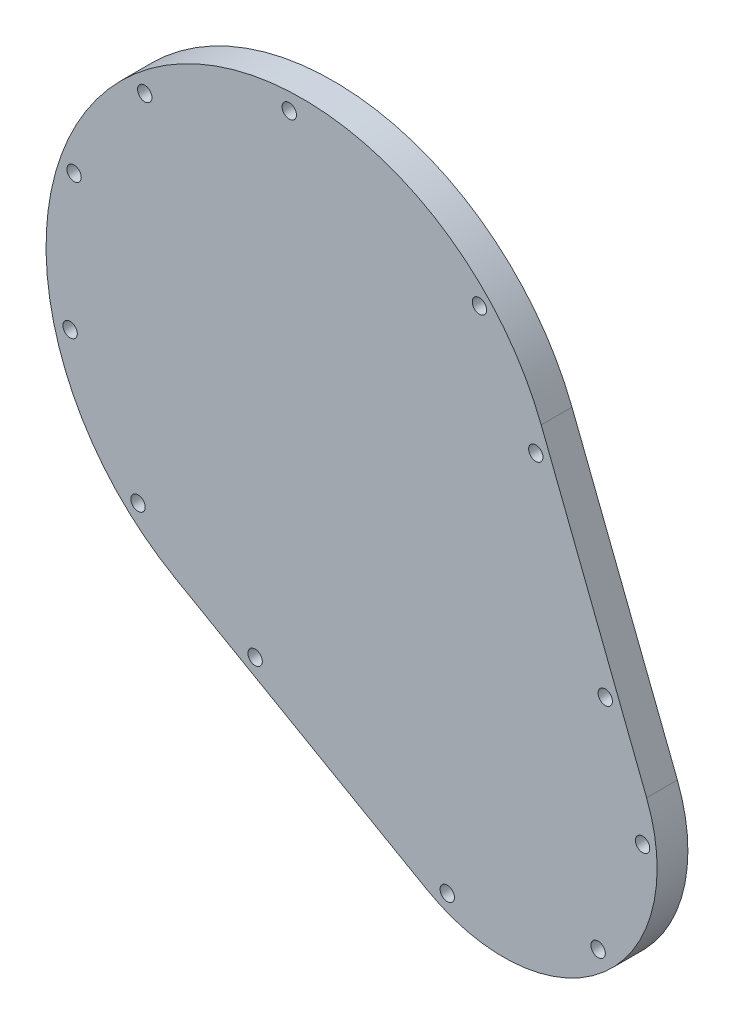
ISO-10303-21;
HEADER;
FILE_DESCRIPTION(('STEP AP214'),'2;1');
FILE_NAME('part.step','',(''),(''),'','','');
FILE_SCHEMA(('AUTOMOTIVE_DESIGN { 1 0 10303 214 1 1 1 1 }'));
ENDSEC;
DATA;
#1=APPLICATION_CONTEXT('core data for automotive mechanical design processes');
#2=APPLICATION_PROTOCOL_DEFINITION('international standard','automotive_design',2000,#1);
#3=PRODUCT_CONTEXT('',#1,'mechanical');
#4=PRODUCT('Part','Part','',(#3));
#5=PRODUCT_RELATED_PRODUCT_CATEGORY('part','',(#4));
#6=PRODUCT_DEFINITION_FORMATION('','',#4);
#7=PRODUCT_DEFINITION_CONTEXT('part definition',#1,'design');
#8=PRODUCT_DEFINITION('design','',#6,#7);
#9=PRODUCT_DEFINITION_SHAPE('','',#8);
#10=(LENGTH_UNIT() NAMED_UNIT(*) SI_UNIT(.MILLI.,.METRE.));
#11=(NAMED_UNIT(*) PLANE_ANGLE_UNIT() SI_UNIT($,.RADIAN.));
#12=(NAMED_UNIT(*) SI_UNIT($,.STERADIAN.) SOLID_ANGLE_UNIT());
#13=UNCERTAINTY_MEASURE_WITH_UNIT(LENGTH_MEASURE(1.E-05),#10,'distance_accuracy_value','');
#14=(GEOMETRIC_REPRESENTATION_CONTEXT(3) GLOBAL_UNCERTAINTY_ASSIGNED_CONTEXT((#13)) GLOBAL_UNIT_ASSIGNED_CONTEXT((#10,
#11,#12)) REPRESENTATION_CONTEXT('',''));
#15=CARTESIAN_POINT('',(0.,0.,0.));
#16=DIRECTION('',(0.,0.,1.));
#17=DIRECTION('',(1.,0.,0.));
#18=AXIS2_PLACEMENT_3D('',#15,#16,#17);
#19=CARTESIAN_POINT('',(15.7540834815016,27.5657641587872,3.81));
#20=DIRECTION('',(0.,0.,-1.));
#21=DIRECTION('',(-1.,0.,0.));
#22=AXIS2_PLACEMENT_3D('',#19,#20,#21);
#23=CYLINDRICAL_SURFACE('',#22,31.75);
#24=CARTESIAN_POINT('',(15.7540834815016,27.5657641587872,0.));
#25=DIRECTION('',(0.,0.,1.));
#26=DIRECTION('',(1.,0.,0.));
#27=AXIS2_PLACEMENT_3D('',#24,#25,#26);
#28=CIRCLE('',#27,31.75);
#29=CARTESIAN_POINT('',(45.3334273140184,39.1037413834896,0.));
#30=VERTEX_POINT('',#29);
#31=CARTESIAN_POINT('',(0.,0.,0.));
#32=VERTEX_POINT('',#31);
#33=EDGE_CURVE('E113',#30,#32,#28,.T.);
#34=ORIENTED_EDGE('',*,*,#33,.T.);
#35=DIRECTION('',(0.,0.,-1.));
#36=VECTOR('',#35,1.);
#37=CARTESIAN_POINT('',(0.,0.,3.81));
#38=LINE('',#37,#36);
#39=CARTESIAN_POINT('',(0.,0.,3.81));
#40=VERTEX_POINT('',#39);
#41=EDGE_CURVE('E11',#40,#32,#38,.T.);
#42=ORIENTED_EDGE('',*,*,#41,.F.);
#43=CARTESIAN_POINT('',(15.7540834815016,27.5657641587872,3.81));
#44=DIRECTION('',(0.,0.,1.));
#45=DIRECTION('',(1.,0.,0.));
#46=AXIS2_PLACEMENT_3D('',#43,#44,#45);
#47=CIRCLE('',#46,31.75);
#48=CARTESIAN_POINT('',(45.3334273140184,39.1037413834896,3.81));
#49=VERTEX_POINT('',#48);
#50=EDGE_CURVE('E97',#49,#40,#47,.T.);
#51=ORIENTED_EDGE('',*,*,#50,.F.);
#52=DIRECTION('',(0.,0.,-1.));
#53=VECTOR('',#52,1.);
#54=CARTESIAN_POINT('',(45.3334273140184,39.1037413834896,3.81));
#55=LINE('',#54,#53);
#56=EDGE_CURVE('E109',#49,#30,#55,.T.);
#57=ORIENTED_EDGE('',*,*,#56,.T.);
#58=EDGE_LOOP('',(#34,#42,#51,#57));
#59=FACE_BOUND('',#58,.T.);
#60=ADVANCED_FACE('F45',(#59),#23,.T.);
#61=CARTESIAN_POINT('',(0.,0.,3.81));
#62=DIRECTION('',(0.496191605716585,0.868213044371252,0.));
#63=DIRECTION('',(-0.868213044371252,0.496191605716585,0.));
#64=AXIS2_PLACEMENT_3D('',#61,#62,#63);
#65=PLANE('',#64);
#66=DIRECTION('',(0.868213044371252,-0.496191605716584,0.));
#67=VECTOR('',#66,1.);
#68=CARTESIAN_POINT('',(0.,0.,0.));
#69=LINE('',#68,#67);
#70=CARTESIAN_POINT('',(31.1871020244281,-17.823710817838,0.));
#71=VERTEX_POINT('',#70);
#72=EDGE_CURVE('E102',#32,#71,#69,.T.);
#73=ORIENTED_EDGE('',*,*,#72,.T.);
#74=DIRECTION('',(0.,0.,-1.));
#75=VECTOR('',#74,1.);
#76=CARTESIAN_POINT('',(31.1871020244281,-17.823710817838,3.81));
#77=LINE('',#76,#75);
#78=CARTESIAN_POINT('',(31.1871020244281,-17.823710817838,3.81));
#79=VERTEX_POINT('',#78);
#80=EDGE_CURVE('E54',#79,#71,#77,.T.);
#81=ORIENTED_EDGE('',*,*,#80,.F.);
#82=DIRECTION('',(0.868213044371252,-0.496191605716584,0.));
#83=VECTOR('',#82,1.);
#84=CARTESIAN_POINT('',(0.,0.,3.81));
#85=LINE('',#84,#83);
#86=EDGE_CURVE('E92',#40,#79,#85,.T.);
#87=ORIENTED_EDGE('',*,*,#86,.F.);
#88=ORIENTED_EDGE('',*,*,#41,.T.);
#89=EDGE_LOOP('',(#73,#81,#87,#88));
#90=FACE_BOUND('',#89,.T.);
#91=ADVANCED_FACE('F101',(#90),#65,.F.);
#92=CARTESIAN_POINT('',(40.639552113329,-1.28425232256561,3.81));
#93=DIRECTION('',(0.,0.,-1.));
#94=DIRECTION('',(-1.,0.,0.));
#95=AXIS2_PLACEMENT_3D('',#92,#93,#94);
#96=CYLINDRICAL_SURFACE('',#95,19.05);
#97=CARTESIAN_POINT('',(40.639552113329,-1.28425232256561,0.));
#98=DIRECTION('',(0.,0.,1.));
#99=DIRECTION('',(1.,0.,0.));
#100=AXIS2_PLACEMENT_3D('',#97,#98,#99);
#101=CIRCLE('',#100,19.05);
#102=CARTESIAN_POINT('',(58.3871584128391,5.63853401225579,0.));
#103=VERTEX_POINT('',#102);
#104=EDGE_CURVE('E79',#71,#103,#101,.T.);
#105=ORIENTED_EDGE('',*,*,#104,.T.);
#106=DIRECTION('',(0.,0.,-1.));
#107=VECTOR('',#106,1.);
#108=CARTESIAN_POINT('',(58.3871584128391,5.63853401225579,3.81));
#109=LINE('',#108,#107);
#110=CARTESIAN_POINT('',(58.3871584128391,5.63853401225579,3.81));
#111=VERTEX_POINT('',#110);
#112=EDGE_CURVE('E104',#111,#103,#109,.T.);
#113=ORIENTED_EDGE('',*,*,#112,.F.);
#114=CARTESIAN_POINT('',(40.639552113329,-1.28425232256561,3.81));
#115=DIRECTION('',(0.,0.,1.));
#116=DIRECTION('',(1.,0.,0.));
#117=AXIS2_PLACEMENT_3D('',#114,#115,#116);
#118=CIRCLE('',#117,19.05);
#119=EDGE_CURVE('E95',#79,#111,#118,.T.);
#120=ORIENTED_EDGE('',*,*,#119,.F.);
#121=ORIENTED_EDGE('',*,*,#80,.T.);
#122=EDGE_LOOP('',(#105,#113,#120,#121));
#123=FACE_BOUND('',#122,.T.);
#124=ADVANCED_FACE('F105',(#123),#96,.T.);
#125=CARTESIAN_POINT('',(58.3871584128391,5.63853401225578,3.81));
#126=DIRECTION('',(-0.931632876614703,-0.363400857470939,0.));
#127=DIRECTION('',(0.363400857470939,-0.931632876614703,0.));
#128=AXIS2_PLACEMENT_3D('',#125,#126,#127);
#129=PLANE('',#128);
#130=DIRECTION('',(-0.363400857470939,0.931632876614703,0.));
#131=VECTOR('',#130,1.);
#132=CARTESIAN_POINT('',(58.3871584128391,5.63853401225578,0.));
#133=LINE('',#132,#131);
#134=EDGE_CURVE('E85',#103,#30,#133,.T.);
#135=ORIENTED_EDGE('',*,*,#134,.T.);
#136=ORIENTED_EDGE('',*,*,#56,.F.);
#137=DIRECTION('',(-0.363400857470939,0.931632876614703,0.));
#138=VECTOR('',#137,1.);
#139=CARTESIAN_POINT('',(58.3871584128391,5.63853401225578,3.81));
#140=LINE('',#139,#138);
#141=EDGE_CURVE('E62',#111,#49,#140,.T.);
#142=ORIENTED_EDGE('',*,*,#141,.F.);
#143=ORIENTED_EDGE('',*,*,#112,.T.);
#144=EDGE_LOOP('',(#135,#136,#142,#143));
#145=FACE_BOUND('',#144,.T.);
#146=ADVANCED_FACE('F127',(#145),#129,.F.);
#147=CARTESIAN_POINT('',(15.7540834815016,27.5657641587872,3.81));
#148=DIRECTION('',(0.,0.,1.));
#149=DIRECTION('',(1.,0.,0.));
#150=AXIS2_PLACEMENT_3D('',#147,#148,#149);
#151=PLANE('',#150);
#152=CARTESIAN_POINT('',(-3.77016974643415,50.098384989217,3.81));
#153=DIRECTION('',(0.,0.,1.));
#154=DIRECTION('',(1.,0.,0.));
#155=AXIS2_PLACEMENT_3D('',#152,#153,#154);
#156=CIRCLE('',#155,0.888999999999987);
#157=CARTESIAN_POINT('',(-2.88116974643417,50.098384989217,3.81));
#158=VERTEX_POINT('',#157);
#159=EDGE_CURVE('E225',#158,#158,#156,.T.);
#160=ORIENTED_EDGE('',*,*,#159,.F.);
#161=EDGE_LOOP('',(#160));
#162=FACE_BOUND('',#161,.T.);
#163=CARTESIAN_POINT('',(14.1273033168311,57.178704003256,3.81));
#164=DIRECTION('',(0.,0.,1.));
#165=DIRECTION('',(1.,0.,0.));
#166=AXIS2_PLACEMENT_3D('',#163,#164,#165);
#167=CIRCLE('',#166,0.888999999999987);
#168=CARTESIAN_POINT('',(15.0163033168311,57.178704003256,3.81));
#169=VERTEX_POINT('',#168);
#170=EDGE_CURVE('E217',#169,#169,#167,.T.);
#171=ORIENTED_EDGE('',*,*,#170,.F.);
#172=EDGE_LOOP('',(#171));
#173=FACE_BOUND('',#172,.T.);
#174=CARTESIAN_POINT('',(37.6791978149192,48.0332919434556,3.81));
#175=DIRECTION('',(0.,0.,1.));
#176=DIRECTION('',(1.,0.,0.));
#177=AXIS2_PLACEMENT_3D('',#174,#175,#176);
#178=CIRCLE('',#177,0.888999999999987);
#179=CARTESIAN_POINT('',(38.5681978149191,48.0332919434556,3.81));
#180=VERTEX_POINT('',#179);
#181=EDGE_CURVE('E209',#180,#180,#178,.T.);
#182=ORIENTED_EDGE('',*,*,#181,.F.);
#183=EDGE_LOOP('',(#182));
#184=FACE_BOUND('',#183,.T.);
#185=CARTESIAN_POINT('',(57.8876083341555,0.388645244818161,3.81));
#186=DIRECTION('',(0.,0.,1.));
#187=DIRECTION('',(1.,0.,0.));
#188=AXIS2_PLACEMENT_3D('',#185,#186,#187);
#189=CIRCLE('',#188,0.888999999999987);
#190=CARTESIAN_POINT('',(58.7766083341554,0.388645244818161,3.81));
#191=VERTEX_POINT('',#190);
#192=EDGE_CURVE('E201',#191,#191,#189,.T.);
#193=ORIENTED_EDGE('',*,*,#192,.F.);
#194=EDGE_LOOP('',(#193));
#195=FACE_BOUND('',#194,.T.);
#196=CARTESIAN_POINT('',(52.3806935454585,-13.624486137134,3.81));
#197=DIRECTION('',(0.,0.,1.));
#198=DIRECTION('',(1.,0.,0.));
#199=AXIS2_PLACEMENT_3D('',#196,#197,#198);
#200=CIRCLE('',#199,0.888999999999987);
#201=CARTESIAN_POINT('',(53.2696935454585,-13.624486137134,3.81));
#202=VERTEX_POINT('',#201);
#203=EDGE_CURVE('E193',#202,#202,#200,.T.);
#204=ORIENTED_EDGE('',*,*,#203,.F.);
#205=EDGE_LOOP('',(#204));
#206=FACE_BOUND('',#205,.T.);
#207=CARTESIAN_POINT('',(33.6965183695222,-16.9679701159858,3.81));
#208=DIRECTION('',(0.,0.,1.));
#209=DIRECTION('',(1.,0.,0.));
#210=AXIS2_PLACEMENT_3D('',#207,#208,#209);
#211=CIRCLE('',#210,0.888999999999987);
#212=CARTESIAN_POINT('',(34.5855183695222,-16.9679701159858,3.81));
#213=VERTEX_POINT('',#212);
#214=EDGE_CURVE('E185',#213,#213,#211,.T.);
#215=ORIENTED_EDGE('',*,*,#214,.F.);
#216=EDGE_LOOP('',(#215));
#217=FACE_BOUND('',#216,.T.);
#218=CARTESIAN_POINT('',(9.89877946122447,-3.54486531853684,3.81));
#219=DIRECTION('',(0.,0.,1.));
#220=DIRECTION('',(1.,0.,0.));
#221=AXIS2_PLACEMENT_3D('',#218,#219,#220);
#222=CIRCLE('',#221,0.888999999999987);
#223=CARTESIAN_POINT('',(10.7877794612245,-3.54486531853684,3.81));
#224=VERTEX_POINT('',#223);
#225=EDGE_CURVE('E177',#224,#224,#222,.T.);
#226=ORIENTED_EDGE('',*,*,#225,.F.);
#227=EDGE_LOOP('',(#226));
#228=FACE_BOUND('',#227,.T.);
#229=CARTESIAN_POINT('',(-4.60604074114709,5.74805338738934,3.81));
#230=DIRECTION('',(0.,0.,1.));
#231=DIRECTION('',(1.,0.,0.));
#232=AXIS2_PLACEMENT_3D('',#229,#230,#231);
#233=CIRCLE('',#232,0.888999999999987);
#234=CARTESIAN_POINT('',(-3.71704074114711,5.74805338738934,3.81));
#235=VERTEX_POINT('',#234);
#236=EDGE_CURVE('E169',#235,#235,#233,.T.);
#237=ORIENTED_EDGE('',*,*,#236,.F.);
#238=EDGE_LOOP('',(#237));
#239=FACE_BOUND('',#238,.T.);
#240=CARTESIAN_POINT('',(-13.0139195703184,20.154535825677,3.81));
#241=DIRECTION('',(0.,0.,1.));
#242=DIRECTION('',(1.,0.,0.));
#243=AXIS2_PLACEMENT_3D('',#240,#241,#242);
#244=CIRCLE('',#243,0.888999999999987);
#245=CARTESIAN_POINT('',(-12.1249195703184,20.154535825677,3.81));
#246=VERTEX_POINT('',#245);
#247=EDGE_CURVE('E161',#246,#246,#244,.T.);
#248=ORIENTED_EDGE('',*,*,#247,.F.);
#249=EDGE_LOOP('',(#248));
#250=FACE_BOUND('',#249,.T.);
#251=CARTESIAN_POINT('',(-12.522230749899,37.1669690121874,3.81));
#252=DIRECTION('',(0.,0.,1.));
#253=DIRECTION('',(1.,0.,0.));
#254=AXIS2_PLACEMENT_3D('',#251,#252,#253);
#255=CIRCLE('',#254,0.888999999999987);
#256=CARTESIAN_POINT('',(-11.633230749899,37.1669690121874,3.81));
#257=VERTEX_POINT('',#256);
#258=EDGE_CURVE('E153',#257,#257,#255,.T.);
#259=ORIENTED_EDGE('',*,*,#258,.F.);
#260=EDGE_LOOP('',(#259));
#261=FACE_BOUND('',#260,.T.);
#262=CARTESIAN_POINT('',(44.6611790648743,35.7410714329712,3.81));
#263=DIRECTION('',(0.,0.,1.));
#264=DIRECTION('',(1.,0.,0.));
#265=AXIS2_PLACEMENT_3D('',#262,#263,#264);
#266=CIRCLE('',#265,0.888999999999987);
#267=CARTESIAN_POINT('',(45.5501790648743,35.7410714329712,3.81));
#268=VERTEX_POINT('',#267);
#269=EDGE_CURVE('E145',#268,#268,#266,.T.);
#270=ORIENTED_EDGE('',*,*,#269,.F.);
#271=EDGE_LOOP('',(#270));
#272=FACE_BOUND('',#271,.T.);
#273=CARTESIAN_POINT('',(53.2657334222133,13.860918924309,3.81));
#274=DIRECTION('',(0.,0.,1.));
#275=DIRECTION('',(1.,0.,0.));
#276=AXIS2_PLACEMENT_3D('',#273,#274,#275);
#277=CIRCLE('',#276,0.888999999999987);
#278=CARTESIAN_POINT('',(54.1547334222133,13.860918924309,3.81));
#279=VERTEX_POINT('',#278);
#280=EDGE_CURVE('E137',#279,#279,#277,.T.);
#281=ORIENTED_EDGE('',*,*,#280,.F.);
#282=EDGE_LOOP('',(#281));
#283=FACE_BOUND('',#282,.T.);
#284=ORIENTED_EDGE('',*,*,#50,.T.);
#285=ORIENTED_EDGE('',*,*,#86,.T.);
#286=ORIENTED_EDGE('',*,*,#119,.T.);
#287=ORIENTED_EDGE('',*,*,#141,.T.);
#288=EDGE_LOOP('',(#284,#285,#286,#287));
#289=FACE_BOUND('',#288,.T.);
#290=ADVANCED_FACE('F93',(#162,#173,#184,#195,#206,#217,#228,#239,#250,#261,#272,#283,#289),
#151,.T.);
#291=CARTESIAN_POINT('',(15.7540834815016,27.5657641587872,0.));
#292=DIRECTION('',(0.,0.,1.));
#293=DIRECTION('',(1.,0.,0.));
#294=AXIS2_PLACEMENT_3D('',#291,#292,#293);
#295=PLANE('',#294);
#296=CARTESIAN_POINT('',(-3.77016974643415,50.098384989217,0.));
#297=DIRECTION('',(0.,0.,1.));
#298=DIRECTION('',(1.,0.,0.));
#299=AXIS2_PLACEMENT_3D('',#296,#297,#298);
#300=CIRCLE('',#299,0.888999999999998);
#301=CARTESIAN_POINT('',(-2.88116974643416,50.098384989217,0.));
#302=VERTEX_POINT('',#301);
#303=EDGE_CURVE('E221',#302,#302,#300,.T.);
#304=ORIENTED_EDGE('',*,*,#303,.T.);
#305=EDGE_LOOP('',(#304));
#306=FACE_BOUND('',#305,.T.);
#307=CARTESIAN_POINT('',(14.1273033168311,57.178704003256,0.));
#308=DIRECTION('',(0.,0.,1.));
#309=DIRECTION('',(1.,0.,0.));
#310=AXIS2_PLACEMENT_3D('',#307,#308,#309);
#311=CIRCLE('',#310,0.888999999999997);
#312=CARTESIAN_POINT('',(15.0163033168311,57.178704003256,0.));
#313=VERTEX_POINT('',#312);
#314=EDGE_CURVE('E213',#313,#313,#311,.T.);
#315=ORIENTED_EDGE('',*,*,#314,.T.);
#316=EDGE_LOOP('',(#315));
#317=FACE_BOUND('',#316,.T.);
#318=CARTESIAN_POINT('',(37.6791978149192,48.0332919434556,0.));
#319=DIRECTION('',(0.,0.,1.));
#320=DIRECTION('',(1.,0.,0.));
#321=AXIS2_PLACEMENT_3D('',#318,#319,#320);
#322=CIRCLE('',#321,0.889000000000001);
#323=CARTESIAN_POINT('',(38.5681978149192,48.0332919434556,0.));
#324=VERTEX_POINT('',#323);
#325=EDGE_CURVE('E205',#324,#324,#322,.T.);
#326=ORIENTED_EDGE('',*,*,#325,.T.);
#327=EDGE_LOOP('',(#326));
#328=FACE_BOUND('',#327,.T.);
#329=CARTESIAN_POINT('',(57.8876083341555,0.388645244818161,0.));
#330=DIRECTION('',(0.,0.,1.));
#331=DIRECTION('',(1.,0.,0.));
#332=AXIS2_PLACEMENT_3D('',#329,#330,#331);
#333=CIRCLE('',#332,0.889000000000001);
#334=CARTESIAN_POINT('',(58.7766083341555,0.388645244818161,0.));
#335=VERTEX_POINT('',#334);
#336=EDGE_CURVE('E197',#335,#335,#333,.T.);
#337=ORIENTED_EDGE('',*,*,#336,.T.);
#338=EDGE_LOOP('',(#337));
#339=FACE_BOUND('',#338,.T.);
#340=CARTESIAN_POINT('',(52.3806935454585,-13.624486137134,0.));
#341=DIRECTION('',(0.,0.,1.));
#342=DIRECTION('',(1.,0.,0.));
#343=AXIS2_PLACEMENT_3D('',#340,#341,#342);
#344=CIRCLE('',#343,0.889000000000001);
#345=CARTESIAN_POINT('',(53.2696935454585,-13.624486137134,0.));
#346=VERTEX_POINT('',#345);
#347=EDGE_CURVE('E189',#346,#346,#344,.T.);
#348=ORIENTED_EDGE('',*,*,#347,.T.);
#349=EDGE_LOOP('',(#348));
#350=FACE_BOUND('',#349,.T.);
#351=CARTESIAN_POINT('',(33.6965183695222,-16.9679701159858,0.));
#352=DIRECTION('',(0.,0.,1.));
#353=DIRECTION('',(1.,0.,0.));
#354=AXIS2_PLACEMENT_3D('',#351,#352,#353);
#355=CIRCLE('',#354,0.889000000000001);
#356=CARTESIAN_POINT('',(34.5855183695222,-16.9679701159858,0.));
#357=VERTEX_POINT('',#356);
#358=EDGE_CURVE('E181',#357,#357,#355,.T.);
#359=ORIENTED_EDGE('',*,*,#358,.T.);
#360=EDGE_LOOP('',(#359));
#361=FACE_BOUND('',#360,.T.);
#362=CARTESIAN_POINT('',(9.89877946122447,-3.54486531853684,0.));
#363=DIRECTION('',(0.,0.,1.));
#364=DIRECTION('',(1.,0.,0.));
#365=AXIS2_PLACEMENT_3D('',#362,#363,#364);
#366=CIRCLE('',#365,0.888999999999997);
#367=CARTESIAN_POINT('',(10.7877794612245,-3.54486531853684,0.));
#368=VERTEX_POINT('',#367);
#369=EDGE_CURVE('E173',#368,#368,#366,.T.);
#370=ORIENTED_EDGE('',*,*,#369,.T.);
#371=EDGE_LOOP('',(#370));
#372=FACE_BOUND('',#371,.T.);
#373=CARTESIAN_POINT('',(-4.60604074114709,5.74805338738934,0.));
#374=DIRECTION('',(0.,0.,1.));
#375=DIRECTION('',(1.,0.,0.));
#376=AXIS2_PLACEMENT_3D('',#373,#374,#375);
#377=CIRCLE('',#376,0.888999999999998);
#378=CARTESIAN_POINT('',(-3.7170407411471,5.74805338738934,0.));
#379=VERTEX_POINT('',#378);
#380=EDGE_CURVE('E165',#379,#379,#377,.T.);
#381=ORIENTED_EDGE('',*,*,#380,.T.);
#382=EDGE_LOOP('',(#381));
#383=FACE_BOUND('',#382,.T.);
#384=CARTESIAN_POINT('',(-13.0139195703184,20.154535825677,0.));
#385=DIRECTION('',(0.,0.,1.));
#386=DIRECTION('',(1.,0.,0.));
#387=AXIS2_PLACEMENT_3D('',#384,#385,#386);
#388=CIRCLE('',#387,0.888999999999997);
#389=CARTESIAN_POINT('',(-12.1249195703184,20.154535825677,0.));
#390=VERTEX_POINT('',#389);
#391=EDGE_CURVE('E157',#390,#390,#388,.T.);
#392=ORIENTED_EDGE('',*,*,#391,.T.);
#393=EDGE_LOOP('',(#392));
#394=FACE_BOUND('',#393,.T.);
#395=CARTESIAN_POINT('',(-12.522230749899,37.1669690121874,0.));
#396=DIRECTION('',(0.,0.,1.));
#397=DIRECTION('',(1.,0.,0.));
#398=AXIS2_PLACEMENT_3D('',#395,#396,#397);
#399=CIRCLE('',#398,0.888999999999997);
#400=CARTESIAN_POINT('',(-11.633230749899,37.1669690121874,0.));
#401=VERTEX_POINT('',#400);
#402=EDGE_CURVE('E149',#401,#401,#399,.T.);
#403=ORIENTED_EDGE('',*,*,#402,.T.);
#404=EDGE_LOOP('',(#403));
#405=FACE_BOUND('',#404,.T.);
#406=CARTESIAN_POINT('',(44.6611790648743,35.7410714329712,0.));
#407=DIRECTION('',(0.,0.,1.));
#408=DIRECTION('',(1.,0.,0.));
#409=AXIS2_PLACEMENT_3D('',#406,#407,#408);
#410=CIRCLE('',#409,0.889000000000001);
#411=CARTESIAN_POINT('',(45.5501790648743,35.7410714329712,0.));
#412=VERTEX_POINT('',#411);
#413=EDGE_CURVE('E141',#412,#412,#410,.T.);
#414=ORIENTED_EDGE('',*,*,#413,.T.);
#415=EDGE_LOOP('',(#414));
#416=FACE_BOUND('',#415,.T.);
#417=CARTESIAN_POINT('',(53.2657334222133,13.860918924309,0.));
#418=DIRECTION('',(0.,0.,1.));
#419=DIRECTION('',(1.,0.,0.));
#420=AXIS2_PLACEMENT_3D('',#417,#418,#419);
#421=CIRCLE('',#420,0.889000000000001);
#422=CARTESIAN_POINT('',(54.1547334222133,13.860918924309,0.));
#423=VERTEX_POINT('',#422);
#424=EDGE_CURVE('E117',#423,#423,#421,.T.);
#425=ORIENTED_EDGE('',*,*,#424,.T.);
#426=EDGE_LOOP('',(#425));
#427=FACE_BOUND('',#426,.T.);
#428=ORIENTED_EDGE('',*,*,#33,.F.);
#429=ORIENTED_EDGE('',*,*,#134,.F.);
#430=ORIENTED_EDGE('',*,*,#104,.F.);
#431=ORIENTED_EDGE('',*,*,#72,.F.);
#432=EDGE_LOOP('',(#428,#429,#430,#431));
#433=FACE_BOUND('',#432,.T.);
#434=ADVANCED_FACE('F130',(#306,#317,#328,#339,#350,#361,#372,#383,#394,#405,#416,#427,#433),
#295,.F.);
#435=CARTESIAN_POINT('',(53.2657334222133,13.860918924309,3.81));
#436=DIRECTION('',(0.,0.,1.));
#437=DIRECTION('',(1.,0.,0.));
#438=AXIS2_PLACEMENT_3D('',#435,#436,#437);
#439=CYLINDRICAL_SURFACE('',#438,0.888999999999994);
#440=ORIENTED_EDGE('',*,*,#424,.F.);
#441=EDGE_LOOP('',(#440));
#442=FACE_BOUND('',#441,.T.);
#443=ORIENTED_EDGE('',*,*,#280,.T.);
#444=EDGE_LOOP('',(#443));
#445=FACE_BOUND('',#444,.T.);
#446=ADVANCED_FACE('F257',(#442,#445),#439,.F.);
#447=CARTESIAN_POINT('',(44.6611790648743,35.7410714329712,3.81));
#448=DIRECTION('',(0.,0.,1.));
#449=DIRECTION('',(1.,0.,0.));
#450=AXIS2_PLACEMENT_3D('',#447,#448,#449);
#451=CYLINDRICAL_SURFACE('',#450,0.888999999999994);
#452=ORIENTED_EDGE('',*,*,#413,.F.);
#453=EDGE_LOOP('',(#452));
#454=FACE_BOUND('',#453,.T.);
#455=ORIENTED_EDGE('',*,*,#269,.T.);
#456=EDGE_LOOP('',(#455));
#457=FACE_BOUND('',#456,.T.);
#458=ADVANCED_FACE('F259',(#454,#457),#451,.F.);
#459=CARTESIAN_POINT('',(-12.522230749899,37.1669690121874,3.81));
#460=DIRECTION('',(0.,0.,1.));
#461=DIRECTION('',(1.,0.,0.));
#462=AXIS2_PLACEMENT_3D('',#459,#460,#461);
#463=CYLINDRICAL_SURFACE('',#462,0.888999999999992);
#464=ORIENTED_EDGE('',*,*,#402,.F.);
#465=EDGE_LOOP('',(#464));
#466=FACE_BOUND('',#465,.T.);
#467=ORIENTED_EDGE('',*,*,#258,.T.);
#468=EDGE_LOOP('',(#467));
#469=FACE_BOUND('',#468,.T.);
#470=ADVANCED_FACE('F266',(#466,#469),#463,.F.);
#471=CARTESIAN_POINT('',(-13.0139195703184,20.154535825677,3.81));
#472=DIRECTION('',(0.,0.,1.));
#473=DIRECTION('',(1.,0.,0.));
#474=AXIS2_PLACEMENT_3D('',#471,#472,#473);
#475=CYLINDRICAL_SURFACE('',#474,0.888999999999992);
#476=ORIENTED_EDGE('',*,*,#391,.F.);
#477=EDGE_LOOP('',(#476));
#478=FACE_BOUND('',#477,.T.);
#479=ORIENTED_EDGE('',*,*,#247,.T.);
#480=EDGE_LOOP('',(#479));
#481=FACE_BOUND('',#480,.T.);
#482=ADVANCED_FACE('F316',(#478,#481),#475,.F.);
#483=CARTESIAN_POINT('',(-4.60604074114709,5.74805338738934,3.81));
#484=DIRECTION('',(0.,0.,1.));
#485=DIRECTION('',(1.,0.,0.));
#486=AXIS2_PLACEMENT_3D('',#483,#484,#485);
#487=CYLINDRICAL_SURFACE('',#486,0.888999999999992);
#488=ORIENTED_EDGE('',*,*,#380,.F.);
#489=EDGE_LOOP('',(#488));
#490=FACE_BOUND('',#489,.T.);
#491=ORIENTED_EDGE('',*,*,#236,.T.);
#492=EDGE_LOOP('',(#491));
#493=FACE_BOUND('',#492,.T.);
#494=ADVANCED_FACE('F327',(#490,#493),#487,.F.);
#495=CARTESIAN_POINT('',(9.89877946122447,-3.54486531853684,3.81));
#496=DIRECTION('',(0.,0.,1.));
#497=DIRECTION('',(1.,0.,0.));
#498=AXIS2_PLACEMENT_3D('',#495,#496,#497);
#499=CYLINDRICAL_SURFACE('',#498,0.888999999999992);
#500=ORIENTED_EDGE('',*,*,#369,.F.);
#501=EDGE_LOOP('',(#500));
#502=FACE_BOUND('',#501,.T.);
#503=ORIENTED_EDGE('',*,*,#225,.T.);
#504=EDGE_LOOP('',(#503));
#505=FACE_BOUND('',#504,.T.);
#506=ADVANCED_FACE('F338',(#502,#505),#499,.F.);
#507=CARTESIAN_POINT('',(33.6965183695222,-16.9679701159858,3.81));
#508=DIRECTION('',(0.,0.,1.));
#509=DIRECTION('',(1.,0.,0.));
#510=AXIS2_PLACEMENT_3D('',#507,#508,#509);
#511=CYLINDRICAL_SURFACE('',#510,0.888999999999994);
#512=ORIENTED_EDGE('',*,*,#358,.F.);
#513=EDGE_LOOP('',(#512));
#514=FACE_BOUND('',#513,.T.);
#515=ORIENTED_EDGE('',*,*,#214,.T.);
#516=EDGE_LOOP('',(#515));
#517=FACE_BOUND('',#516,.T.);
#518=ADVANCED_FACE('F349',(#514,#517),#511,.F.);
#519=CARTESIAN_POINT('',(52.3806935454585,-13.624486137134,3.81));
#520=DIRECTION('',(0.,0.,1.));
#521=DIRECTION('',(1.,0.,0.));
#522=AXIS2_PLACEMENT_3D('',#519,#520,#521);
#523=CYLINDRICAL_SURFACE('',#522,0.888999999999994);
#524=ORIENTED_EDGE('',*,*,#347,.F.);
#525=EDGE_LOOP('',(#524));
#526=FACE_BOUND('',#525,.T.);
#527=ORIENTED_EDGE('',*,*,#203,.T.);
#528=EDGE_LOOP('',(#527));
#529=FACE_BOUND('',#528,.T.);
#530=ADVANCED_FACE('F360',(#526,#529),#523,.F.);
#531=CARTESIAN_POINT('',(57.8876083341555,0.388645244818161,3.81));
#532=DIRECTION('',(0.,0.,1.));
#533=DIRECTION('',(1.,0.,0.));
#534=AXIS2_PLACEMENT_3D('',#531,#532,#533);
#535=CYLINDRICAL_SURFACE('',#534,0.888999999999994);
#536=ORIENTED_EDGE('',*,*,#336,.F.);
#537=EDGE_LOOP('',(#536));
#538=FACE_BOUND('',#537,.T.);
#539=ORIENTED_EDGE('',*,*,#192,.T.);
#540=EDGE_LOOP('',(#539));
#541=FACE_BOUND('',#540,.T.);
#542=ADVANCED_FACE('F371',(#538,#541),#535,.F.);
#543=CARTESIAN_POINT('',(37.6791978149192,48.0332919434556,3.81));
#544=DIRECTION('',(0.,0.,1.));
#545=DIRECTION('',(1.,0.,0.));
#546=AXIS2_PLACEMENT_3D('',#543,#544,#545);
#547=CYLINDRICAL_SURFACE('',#546,0.888999999999994);
#548=ORIENTED_EDGE('',*,*,#325,.F.);
#549=EDGE_LOOP('',(#548));
#550=FACE_BOUND('',#549,.T.);
#551=ORIENTED_EDGE('',*,*,#181,.T.);
#552=EDGE_LOOP('',(#551));
#553=FACE_BOUND('',#552,.T.);
#554=ADVANCED_FACE('F382',(#550,#553),#547,.F.);
#555=CARTESIAN_POINT('',(14.1273033168311,57.178704003256,3.81));
#556=DIRECTION('',(0.,0.,1.));
#557=DIRECTION('',(1.,0.,0.));
#558=AXIS2_PLACEMENT_3D('',#555,#556,#557);
#559=CYLINDRICAL_SURFACE('',#558,0.888999999999992);
#560=ORIENTED_EDGE('',*,*,#314,.F.);
#561=EDGE_LOOP('',(#560));
#562=FACE_BOUND('',#561,.T.);
#563=ORIENTED_EDGE('',*,*,#170,.T.);
#564=EDGE_LOOP('',(#563));
#565=FACE_BOUND('',#564,.T.);
#566=ADVANCED_FACE('F393',(#562,#565),#559,.F.);
#567=CARTESIAN_POINT('',(-3.77016974643415,50.098384989217,3.81));
#568=DIRECTION('',(0.,0.,1.));
#569=DIRECTION('',(1.,0.,0.));
#570=AXIS2_PLACEMENT_3D('',#567,#568,#569);
#571=CYLINDRICAL_SURFACE('',#570,0.888999999999992);
#572=ORIENTED_EDGE('',*,*,#303,.F.);
#573=EDGE_LOOP('',(#572));
#574=FACE_BOUND('',#573,.T.);
#575=ORIENTED_EDGE('',*,*,#159,.T.);
#576=EDGE_LOOP('',(#575));
#577=FACE_BOUND('',#576,.T.);
#578=ADVANCED_FACE('F230',(#574,#577),#571,.F.);
#579=CLOSED_SHELL('',(#60,#91,#124,#146,#290,#434,#446,#458,#470,#482,#494,#506,#518,#530,#542,
#554,#566,#578));
#580=MANIFOLD_SOLID_BREP('B2',#579);
#581=ADVANCED_BREP_SHAPE_REPRESENTATION('',(#18,#580),#14);
#582=SHAPE_DEFINITION_REPRESENTATION(#9,#581);
ENDSEC;
END-ISO-10303-21;
